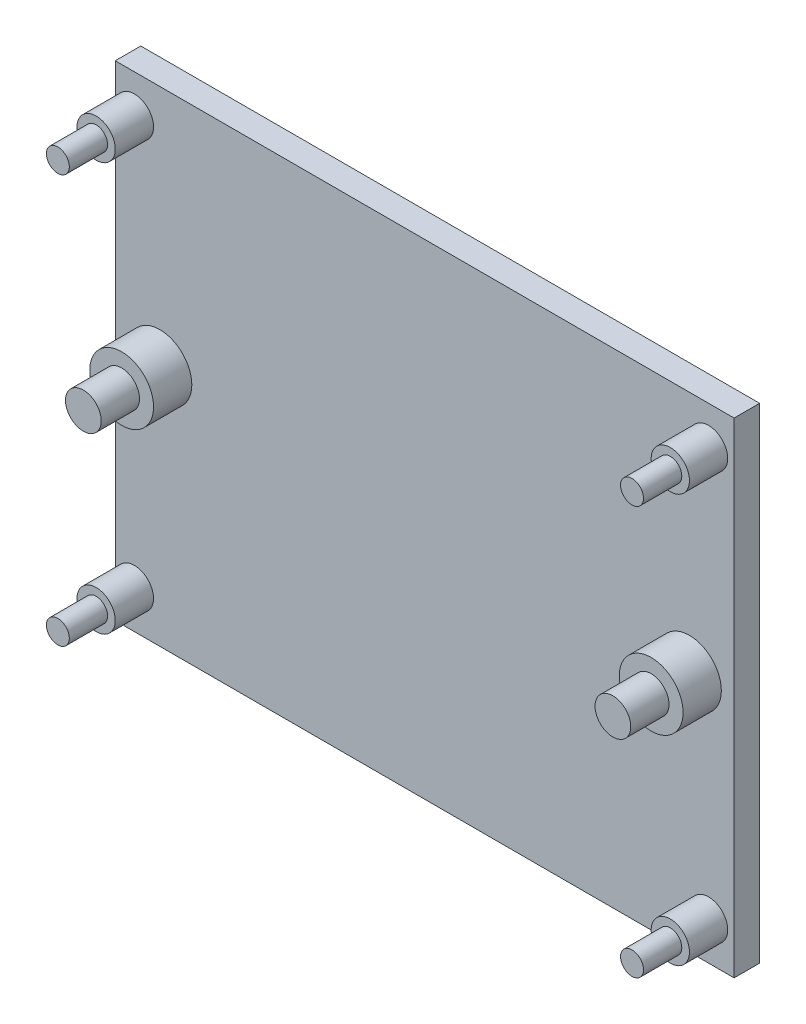
ISO-10303-21;
HEADER;
FILE_DESCRIPTION(('STEP AP214'),'2;1');
FILE_NAME('part.step','',(''),(''),'','','');
FILE_SCHEMA(('AUTOMOTIVE_DESIGN { 1 0 10303 214 1 1 1 1 }'));
ENDSEC;
DATA;
#1=APPLICATION_CONTEXT('core data for automotive mechanical design processes');
#2=APPLICATION_PROTOCOL_DEFINITION('international standard','automotive_design',2000,#1);
#3=PRODUCT_CONTEXT('',#1,'mechanical');
#4=PRODUCT('Part','Part','',(#3));
#5=PRODUCT_RELATED_PRODUCT_CATEGORY('part','',(#4));
#6=PRODUCT_DEFINITION_FORMATION('','',#4);
#7=PRODUCT_DEFINITION_CONTEXT('part definition',#1,'design');
#8=PRODUCT_DEFINITION('design','',#6,#7);
#9=PRODUCT_DEFINITION_SHAPE('','',#8);
#10=(LENGTH_UNIT() NAMED_UNIT(*) SI_UNIT(.MILLI.,.METRE.));
#11=(NAMED_UNIT(*) PLANE_ANGLE_UNIT() SI_UNIT($,.RADIAN.));
#12=(NAMED_UNIT(*) SI_UNIT($,.STERADIAN.) SOLID_ANGLE_UNIT());
#13=UNCERTAINTY_MEASURE_WITH_UNIT(LENGTH_MEASURE(1.E-05),#10,'distance_accuracy_value','');
#14=(GEOMETRIC_REPRESENTATION_CONTEXT(3) GLOBAL_UNCERTAINTY_ASSIGNED_CONTEXT((#13)) GLOBAL_UNIT_ASSIGNED_CONTEXT((#10,
#11,#12)) REPRESENTATION_CONTEXT('',''));
#15=CARTESIAN_POINT('',(0.,0.,0.));
#16=DIRECTION('',(0.,0.,1.));
#17=DIRECTION('',(1.,0.,0.));
#18=AXIS2_PLACEMENT_3D('',#15,#16,#17);
#19=CARTESIAN_POINT('',(0.,0.,0.));
#20=DIRECTION('',(0.,0.,1.));
#21=DIRECTION('',(1.,0.,0.));
#22=AXIS2_PLACEMENT_3D('',#19,#20,#21);
#23=PLANE('',#22);
#24=DIRECTION('',(0.,-1.,0.));
#25=VECTOR('',#24,1.);
#26=CARTESIAN_POINT('',(-8.40044641670906,4.85,0.));
#27=LINE('',#26,#25);
#28=CARTESIAN_POINT('',(-8.40044641670906,4.85,0.));
#29=VERTEX_POINT('',#28);
#30=CARTESIAN_POINT('',(-8.40044641670906,-4.85,0.));
#31=VERTEX_POINT('',#30);
#32=EDGE_CURVE('E317',#29,#31,#27,.T.);
#33=ORIENTED_EDGE('',*,*,#32,.F.);
#34=DIRECTION('',(-0.866025403784439,-0.5,0.));
#35=VECTOR('',#34,1.);
#36=CARTESIAN_POINT('',(0.,9.7,0.));
#37=LINE('',#36,#35);
#38=CARTESIAN_POINT('',(0.,9.7,0.));
#39=VERTEX_POINT('',#38);
#40=EDGE_CURVE('E329',#39,#29,#37,.T.);
#41=ORIENTED_EDGE('',*,*,#40,.F.);
#42=DIRECTION('',(-0.866025403784439,0.5,0.));
#43=VECTOR('',#42,1.);
#44=CARTESIAN_POINT('',(8.40044641670906,4.85,0.));
#45=LINE('',#44,#43);
#46=CARTESIAN_POINT('',(8.40044641670906,4.85,0.));
#47=VERTEX_POINT('',#46);
#48=EDGE_CURVE('E326',#47,#39,#45,.T.);
#49=ORIENTED_EDGE('',*,*,#48,.F.);
#50=DIRECTION('',(0.,1.,0.));
#51=VECTOR('',#50,1.);
#52=CARTESIAN_POINT('',(8.40044641670906,-4.85,0.));
#53=LINE('',#52,#51);
#54=CARTESIAN_POINT('',(8.40044641670906,-4.85,0.));
#55=VERTEX_POINT('',#54);
#56=EDGE_CURVE('E325',#55,#47,#53,.T.);
#57=ORIENTED_EDGE('',*,*,#56,.F.);
#58=DIRECTION('',(0.866025403784439,0.5,0.));
#59=VECTOR('',#58,1.);
#60=CARTESIAN_POINT('',(0.,-9.7,0.));
#61=LINE('',#60,#59);
#62=CARTESIAN_POINT('',(0.,-9.7,0.));
#63=VERTEX_POINT('',#62);
#64=EDGE_CURVE('E318',#63,#55,#61,.T.);
#65=ORIENTED_EDGE('',*,*,#64,.F.);
#66=DIRECTION('',(0.866025403784439,-0.5,0.));
#67=VECTOR('',#66,1.);
#68=CARTESIAN_POINT('',(-8.40044641670906,-4.85,0.));
#69=LINE('',#68,#67);
#70=EDGE_CURVE('E313',#31,#63,#69,.T.);
#71=ORIENTED_EDGE('',*,*,#70,.F.);
#72=EDGE_LOOP('',(#33,#41,#49,#57,#65,#71));
#73=FACE_BOUND('',#72,.T.);
#74=ADVANCED_FACE('F70',(#73),#23,.F.);
#75=CARTESIAN_POINT('',(-4.20022320835453,7.27500000000001,0.));
#76=DIRECTION('',(0.5,-0.866025403784439,0.));
#77=DIRECTION('',(0.866025403784439,0.5,0.));
#78=AXIS2_PLACEMENT_3D('',#75,#76,#77);
#79=PLANE('',#78);
#80=DIRECTION('',(0.,0.,1.));
#81=VECTOR('',#80,1.);
#82=CARTESIAN_POINT('',(-8.40044641670906,4.85,0.));
#83=LINE('',#82,#81);
#84=CARTESIAN_POINT('',(-8.40044641670906,4.85,2.5));
#85=VERTEX_POINT('',#84);
#86=EDGE_CURVE('E333',#29,#85,#83,.T.);
#87=ORIENTED_EDGE('',*,*,#86,.T.);
#88=DIRECTION('',(-0.866025403784439,-0.5,0.));
#89=VECTOR('',#88,1.);
#90=CARTESIAN_POINT('',(0.,9.7,2.5));
#91=LINE('',#90,#89);
#92=CARTESIAN_POINT('',(0.,9.7,2.5));
#93=VERTEX_POINT('',#92);
#94=EDGE_CURVE('E234',#93,#85,#91,.T.);
#95=ORIENTED_EDGE('',*,*,#94,.F.);
#96=DIRECTION('',(0.,0.,1.));
#97=VECTOR('',#96,1.);
#98=CARTESIAN_POINT('',(0.,9.7,0.));
#99=LINE('',#98,#97);
#100=EDGE_CURVE('E355',#39,#93,#99,.T.);
#101=ORIENTED_EDGE('',*,*,#100,.F.);
#102=ORIENTED_EDGE('',*,*,#40,.T.);
#103=EDGE_LOOP('',(#87,#95,#101,#102));
#104=FACE_BOUND('',#103,.T.);
#105=ADVANCED_FACE('F272',(#104),#79,.F.);
#106=CARTESIAN_POINT('',(4.20022320835453,7.275,0.));
#107=DIRECTION('',(-0.5,-0.866025403784439,0.));
#108=DIRECTION('',(0.866025403784439,-0.5,0.));
#109=AXIS2_PLACEMENT_3D('',#106,#107,#108);
#110=PLANE('',#109);
#111=ORIENTED_EDGE('',*,*,#100,.T.);
#112=DIRECTION('',(-0.866025403784439,0.5,0.));
#113=VECTOR('',#112,1.);
#114=CARTESIAN_POINT('',(8.40044641670906,4.85,2.5));
#115=LINE('',#114,#113);
#116=CARTESIAN_POINT('',(8.40044641670906,4.85,2.5));
#117=VERTEX_POINT('',#116);
#118=EDGE_CURVE('E252',#117,#93,#115,.T.);
#119=ORIENTED_EDGE('',*,*,#118,.F.);
#120=DIRECTION('',(0.,0.,1.));
#121=VECTOR('',#120,1.);
#122=CARTESIAN_POINT('',(8.40044641670906,4.85,0.));
#123=LINE('',#122,#121);
#124=EDGE_CURVE('E87',#47,#117,#123,.T.);
#125=ORIENTED_EDGE('',*,*,#124,.F.);
#126=ORIENTED_EDGE('',*,*,#48,.T.);
#127=EDGE_LOOP('',(#111,#119,#125,#126));
#128=FACE_BOUND('',#127,.T.);
#129=ADVANCED_FACE('F353',(#128),#110,.F.);
#130=CARTESIAN_POINT('',(-8.40044641670906,0.,0.));
#131=DIRECTION('',(1.,0.,0.));
#132=DIRECTION('',(0.,0.,-1.));
#133=AXIS2_PLACEMENT_3D('',#130,#131,#132);
#134=PLANE('',#133);
#135=DIRECTION('',(0.,0.,1.));
#136=VECTOR('',#135,1.);
#137=CARTESIAN_POINT('',(-8.40044641670906,-4.85,0.));
#138=LINE('',#137,#136);
#139=CARTESIAN_POINT('',(-8.40044641670906,-4.85,2.5));
#140=VERTEX_POINT('',#139);
#141=EDGE_CURVE('E357',#31,#140,#138,.T.);
#142=ORIENTED_EDGE('',*,*,#141,.T.);
#143=DIRECTION('',(0.,-1.,0.));
#144=VECTOR('',#143,1.);
#145=CARTESIAN_POINT('',(-8.40044641670906,4.85,2.5));
#146=LINE('',#145,#144);
#147=EDGE_CURVE('E233',#85,#140,#146,.T.);
#148=ORIENTED_EDGE('',*,*,#147,.F.);
#149=ORIENTED_EDGE('',*,*,#86,.F.);
#150=ORIENTED_EDGE('',*,*,#32,.T.);
#151=EDGE_LOOP('',(#142,#148,#149,#150));
#152=FACE_BOUND('',#151,.T.);
#153=ADVANCED_FACE('F380',(#152),#134,.F.);
#154=CARTESIAN_POINT('',(-4.20022320835453,-7.27500000000001,0.));
#155=DIRECTION('',(0.5,0.866025403784439,0.));
#156=DIRECTION('',(-0.866025403784439,0.5,0.));
#157=AXIS2_PLACEMENT_3D('',#154,#155,#156);
#158=PLANE('',#157);
#159=DIRECTION('',(0.,0.,1.));
#160=VECTOR('',#159,1.);
#161=CARTESIAN_POINT('',(0.,-9.7,0.));
#162=LINE('',#161,#160);
#163=CARTESIAN_POINT('',(0.,-9.69999999999999,2.5));
#164=VERTEX_POINT('',#163);
#165=EDGE_CURVE('E356',#63,#164,#162,.T.);
#166=ORIENTED_EDGE('',*,*,#165,.T.);
#167=DIRECTION('',(0.866025403784439,-0.5,0.));
#168=VECTOR('',#167,1.);
#169=CARTESIAN_POINT('',(-8.40044641670906,-4.85,2.5));
#170=LINE('',#169,#168);
#171=EDGE_CURVE('E239',#140,#164,#170,.T.);
#172=ORIENTED_EDGE('',*,*,#171,.F.);
#173=ORIENTED_EDGE('',*,*,#141,.F.);
#174=ORIENTED_EDGE('',*,*,#70,.T.);
#175=EDGE_LOOP('',(#166,#172,#173,#174));
#176=FACE_BOUND('',#175,.T.);
#177=ADVANCED_FACE('F387',(#176),#158,.F.);
#178=CARTESIAN_POINT('',(4.20022320835453,-7.275,0.));
#179=DIRECTION('',(-0.5,0.866025403784439,0.));
#180=DIRECTION('',(-0.866025403784439,-0.5,0.));
#181=AXIS2_PLACEMENT_3D('',#178,#179,#180);
#182=PLANE('',#181);
#183=DIRECTION('',(0.,0.,1.));
#184=VECTOR('',#183,1.);
#185=CARTESIAN_POINT('',(8.40044641670906,-4.85,0.));
#186=LINE('',#185,#184);
#187=CARTESIAN_POINT('',(8.40044641670906,-4.84999999999999,2.5));
#188=VERTEX_POINT('',#187);
#189=EDGE_CURVE('E403',#55,#188,#186,.T.);
#190=ORIENTED_EDGE('',*,*,#189,.T.);
#191=DIRECTION('',(0.866025403784439,0.5,0.));
#192=VECTOR('',#191,1.);
#193=CARTESIAN_POINT('',(0.,-9.69999999999999,2.5));
#194=LINE('',#193,#192);
#195=EDGE_CURVE('E242',#164,#188,#194,.T.);
#196=ORIENTED_EDGE('',*,*,#195,.F.);
#197=ORIENTED_EDGE('',*,*,#165,.F.);
#198=ORIENTED_EDGE('',*,*,#64,.T.);
#199=EDGE_LOOP('',(#190,#196,#197,#198));
#200=FACE_BOUND('',#199,.T.);
#201=ADVANCED_FACE('F388',(#200),#182,.F.);
#202=CARTESIAN_POINT('',(8.40044641670906,0.,0.));
#203=DIRECTION('',(-1.,0.,0.));
#204=DIRECTION('',(0.,0.,1.));
#205=AXIS2_PLACEMENT_3D('',#202,#203,#204);
#206=PLANE('',#205);
#207=ORIENTED_EDGE('',*,*,#124,.T.);
#208=DIRECTION('',(0.,1.,0.));
#209=VECTOR('',#208,1.);
#210=CARTESIAN_POINT('',(8.40044641670906,-4.85,2.5));
#211=LINE('',#210,#209);
#212=EDGE_CURVE('E95',#188,#117,#211,.T.);
#213=ORIENTED_EDGE('',*,*,#212,.F.);
#214=ORIENTED_EDGE('',*,*,#189,.F.);
#215=ORIENTED_EDGE('',*,*,#56,.T.);
#216=EDGE_LOOP('',(#207,#213,#214,#215));
#217=FACE_BOUND('',#216,.T.);
#218=ADVANCED_FACE('F67',(#217),#206,.F.);
#219=CARTESIAN_POINT('',(24.25,-19.,5.));
#220=CARTESIAN_POINT('',(8.40044641670906,-4.84999999999999,2.5));
#221=CARTESIAN_POINT('',(20.2083333333333,-19.,5.));
#222=CARTESIAN_POINT('',(7.00037201392421,-5.65833333333333,2.5));
#223=CARTESIAN_POINT('',(16.1666666666667,-19.,5.));
#224=CARTESIAN_POINT('',(5.60029761113937,-6.46666666666666,2.5));
#225=CARTESIAN_POINT('',(8.08333333333334,-19.,5.));
#226=CARTESIAN_POINT('',(2.80014880556969,-8.08333333333333,2.5));
#227=CARTESIAN_POINT('',(4.04166666666668,-19.,5.));
#228=CARTESIAN_POINT('',(1.40007440278484,-8.89166666666666,2.5));
#229=CARTESIAN_POINT('',(0.,-19.,5.));
#230=CARTESIAN_POINT('',(0.,-9.69999999999999,2.5));
#231=B_SPLINE_SURFACE_WITH_KNOTS('',3,1,((#219,#220),(#221,#222),(#223,#224),(#225,#226),(#227,
#228),(#229,#230)),.UNSPECIFIED.,.F.,.F.,.F.,(4,2,4),(2,2),(0.,0.5,1.),(0.,1.),.UNSPECIFIED.);
#232=DIRECTION('',(1.,0.,0.));
#233=VECTOR('',#232,1.);
#234=CARTESIAN_POINT('',(24.25,-19.,5.));
#235=LINE('',#234,#233);
#236=CARTESIAN_POINT('',(0.,-19.,5.));
#237=VERTEX_POINT('',#236);
#238=CARTESIAN_POINT('',(24.25,-19.,5.));
#239=VERTEX_POINT('',#238);
#240=EDGE_CURVE('E199',#237,#239,#235,.T.);
#241=DIRECTION('',(0.,0.965715946433319,-0.259601060869172));
#242=VECTOR('',#241,1.);
#243=CARTESIAN_POINT('',(0.,-14.35,3.75));
#244=LINE('',#243,#242);
#245=EDGE_CURVE('E437',#237,#164,#244,.T.);
#246=DIRECTION('',(0.740859176157228,-0.661416568456314,0.116858050964013));
#247=VECTOR('',#246,1.);
#248=CARTESIAN_POINT('',(16.3252232083545,-11.925,3.75));
#249=LINE('',#248,#247);
#250=EDGE_CURVE('E211',#188,#239,#249,.T.);
#251=ORIENTED_EDGE('',*,*,#240,.F.);
#252=ORIENTED_EDGE('',*,*,#245,.T.);
#253=ORIENTED_EDGE('',*,*,#195,.T.);
#254=ORIENTED_EDGE('',*,*,#250,.T.);
#255=EDGE_LOOP('',(#251,#252,#253,#254));
#256=FACE_BOUND('',#255,.T.);
#257=ADVANCED_FACE('F434',(#256),#231,.T.);
#258=CARTESIAN_POINT('',(0.,-19.,5.));
#259=CARTESIAN_POINT('',(0.,-9.69999999999999,2.5));
#260=CARTESIAN_POINT('',(-4.04166666666665,-19.,5.));
#261=CARTESIAN_POINT('',(-1.40007440278484,-8.89166666666666,2.5));
#262=CARTESIAN_POINT('',(-8.08333333333332,-19.,5.));
#263=CARTESIAN_POINT('',(-2.80014880556968,-8.08333333333333,2.5));
#264=CARTESIAN_POINT('',(-16.1666666666667,-19.,5.));
#265=CARTESIAN_POINT('',(-5.60029761113937,-6.46666666666666,2.5));
#266=CARTESIAN_POINT('',(-20.2083333333333,-19.,5.));
#267=CARTESIAN_POINT('',(-7.00037201392421,-5.65833333333333,2.5));
#268=CARTESIAN_POINT('',(-24.25,-19.,5.));
#269=CARTESIAN_POINT('',(-8.40044641670906,-4.85,2.5));
#270=B_SPLINE_SURFACE_WITH_KNOTS('',3,1,((#258,#259),(#260,#261),(#262,#263),(#264,#265),(#266,
#267),(#268,#269)),.UNSPECIFIED.,.F.,.F.,.F.,(4,2,4),(2,2),(0.,0.5,1.),(0.,1.),.UNSPECIFIED.);
#271=CARTESIAN_POINT('',(-24.25,-19.,5.));
#272=VERTEX_POINT('',#271);
#273=EDGE_CURVE('E203',#272,#237,#235,.T.);
#274=DIRECTION('',(0.740859176157228,0.661416568456314,-0.116858050964013));
#275=VECTOR('',#274,1.);
#276=CARTESIAN_POINT('',(-16.3252232083545,-11.925,3.75));
#277=LINE('',#276,#275);
#278=EDGE_CURVE('E445',#272,#140,#277,.T.);
#279=ORIENTED_EDGE('',*,*,#273,.F.);
#280=ORIENTED_EDGE('',*,*,#278,.T.);
#281=ORIENTED_EDGE('',*,*,#171,.T.);
#282=ORIENTED_EDGE('',*,*,#245,.F.);
#283=EDGE_LOOP('',(#279,#280,#281,#282));
#284=FACE_BOUND('',#283,.T.);
#285=ADVANCED_FACE('F568',(#284),#270,.T.);
#286=CARTESIAN_POINT('',(-0.180832822124491,0.,1.14644780155193));
#287=DIRECTION('',(-0.155806839777312,0.,0.987787542277491));
#288=DIRECTION('',(0.987787542277492,0.,0.155806839777312));
#289=AXIS2_PLACEMENT_3D('',#286,#287,#288);
#290=PLANE('',#289);
#291=ORIENTED_EDGE('',*,*,#250,.F.);
#292=ORIENTED_EDGE('',*,*,#212,.T.);
#293=DIRECTION('',(-0.740859176157228,-0.661416568456314,-0.116858050964013));
#294=VECTOR('',#293,1.);
#295=CARTESIAN_POINT('',(16.3252232083545,11.925,3.75));
#296=LINE('',#295,#294);
#297=CARTESIAN_POINT('',(24.25,19.,5.));
#298=VERTEX_POINT('',#297);
#299=EDGE_CURVE('E343',#298,#117,#296,.T.);
#300=ORIENTED_EDGE('',*,*,#299,.F.);
#301=DIRECTION('',(0.,1.,0.));
#302=VECTOR('',#301,1.);
#303=CARTESIAN_POINT('',(24.25,-19.,5.));
#304=LINE('',#303,#302);
#305=EDGE_CURVE('E204',#239,#298,#304,.T.);
#306=ORIENTED_EDGE('',*,*,#305,.F.);
#307=EDGE_LOOP('',(#291,#292,#300,#306));
#308=FACE_BOUND('',#307,.T.);
#309=ADVANCED_FACE('F439',(#308),#290,.F.);
#310=CARTESIAN_POINT('',(0.180832822124491,0.,1.14644780155194));
#311=DIRECTION('',(0.155806839777312,0.,0.987787542277492));
#312=DIRECTION('',(0.987787542277492,0.,-0.155806839777312));
#313=AXIS2_PLACEMENT_3D('',#310,#311,#312);
#314=PLANE('',#313);
#315=DIRECTION('',(0.740859176157228,-0.661416568456314,-0.116858050964013));
#316=VECTOR('',#315,1.);
#317=CARTESIAN_POINT('',(-24.25,19.,5.));
#318=LINE('',#317,#316);
#319=CARTESIAN_POINT('',(-24.25,19.,5.));
#320=VERTEX_POINT('',#319);
#321=EDGE_CURVE('E455',#320,#85,#318,.T.);
#322=ORIENTED_EDGE('',*,*,#321,.T.);
#323=ORIENTED_EDGE('',*,*,#147,.T.);
#324=ORIENTED_EDGE('',*,*,#278,.F.);
#325=DIRECTION('',(0.,-1.,0.));
#326=VECTOR('',#325,1.);
#327=CARTESIAN_POINT('',(-24.25,-19.,5.));
#328=LINE('',#327,#326);
#329=EDGE_CURVE('E196',#320,#272,#328,.T.);
#330=ORIENTED_EDGE('',*,*,#329,.F.);
#331=EDGE_LOOP('',(#322,#323,#324,#330));
#332=FACE_BOUND('',#331,.T.);
#333=ADVANCED_FACE('F586',(#332),#314,.F.);
#334=CARTESIAN_POINT('',(-24.25,19.,5.));
#335=CARTESIAN_POINT('',(-8.40044641670906,4.85,2.5));
#336=CARTESIAN_POINT('',(-20.2083333333332,19.,5.));
#337=CARTESIAN_POINT('',(-7.00037201392421,5.65833333333333,2.5));
#338=CARTESIAN_POINT('',(-16.1666666666665,19.,5.));
#339=CARTESIAN_POINT('',(-5.60029761113936,6.46666666666667,2.5));
#340=CARTESIAN_POINT('',(-8.08333333333315,19.,5.));
#341=CARTESIAN_POINT('',(-2.80014880556968,8.08333333333334,2.5));
#342=CARTESIAN_POINT('',(-4.04166666666655,19.,5.));
#343=CARTESIAN_POINT('',(-1.40007440278484,8.89166666666667,2.5));
#344=CARTESIAN_POINT('',(0.,19.,5.));
#345=CARTESIAN_POINT('',(0.,9.7,2.5));
#346=B_SPLINE_SURFACE_WITH_KNOTS('',3,1,((#334,#335),(#336,#337),(#338,#339),(#340,#341),(#342,
#343),(#344,#345)),.UNSPECIFIED.,.F.,.F.,.F.,(4,2,4),(2,2),(0.,0.5,1.),(0.,1.),.UNSPECIFIED.);
#347=DIRECTION('',(-1.,0.,0.));
#348=VECTOR('',#347,1.);
#349=CARTESIAN_POINT('',(24.25,19.,5.));
#350=LINE('',#349,#348);
#351=CARTESIAN_POINT('',(0.,19.,5.));
#352=VERTEX_POINT('',#351);
#353=EDGE_CURVE('E195',#352,#320,#350,.T.);
#354=DIRECTION('',(0.,-0.965715946433319,-0.259601060869172));
#355=VECTOR('',#354,1.);
#356=CARTESIAN_POINT('',(0.,14.35,3.75));
#357=LINE('',#356,#355);
#358=EDGE_CURVE('E446',#352,#93,#357,.T.);
#359=ORIENTED_EDGE('',*,*,#353,.F.);
#360=ORIENTED_EDGE('',*,*,#358,.T.);
#361=ORIENTED_EDGE('',*,*,#94,.T.);
#362=ORIENTED_EDGE('',*,*,#321,.F.);
#363=EDGE_LOOP('',(#359,#360,#361,#362));
#364=FACE_BOUND('',#363,.T.);
#365=ADVANCED_FACE('F467',(#364),#346,.T.);
#366=CARTESIAN_POINT('',(0.,19.,5.));
#367=CARTESIAN_POINT('',(0.,9.7,2.5));
#368=CARTESIAN_POINT('',(4.04166666666667,19.,5.));
#369=CARTESIAN_POINT('',(1.40007440278484,8.89166666666667,2.5));
#370=CARTESIAN_POINT('',(8.08333333333334,19.,5.));
#371=CARTESIAN_POINT('',(2.80014880556968,8.08333333333333,2.5));
#372=CARTESIAN_POINT('',(16.1666666666667,19.,5.));
#373=CARTESIAN_POINT('',(5.60029761113937,6.46666666666667,2.5));
#374=CARTESIAN_POINT('',(20.2083333333333,19.,5.));
#375=CARTESIAN_POINT('',(7.00037201392421,5.65833333333333,2.5));
#376=CARTESIAN_POINT('',(24.25,19.,5.));
#377=CARTESIAN_POINT('',(8.40044641670906,4.85,2.5));
#378=B_SPLINE_SURFACE_WITH_KNOTS('',3,1,((#366,#367),(#368,#369),(#370,#371),(#372,#373),(#374,
#375),(#376,#377)),.UNSPECIFIED.,.F.,.F.,.F.,(4,2,4),(2,2),(0.,0.5,1.),(0.,1.),.UNSPECIFIED.);
#379=EDGE_CURVE('E71',#298,#352,#350,.T.);
#380=ORIENTED_EDGE('',*,*,#379,.F.);
#381=ORIENTED_EDGE('',*,*,#299,.T.);
#382=ORIENTED_EDGE('',*,*,#118,.T.);
#383=ORIENTED_EDGE('',*,*,#358,.F.);
#384=EDGE_LOOP('',(#380,#381,#382,#383));
#385=FACE_BOUND('',#384,.T.);
#386=ADVANCED_FACE('F274',(#385),#378,.T.);
#387=CARTESIAN_POINT('',(24.25,19.,7.));
#388=DIRECTION('',(0.,-1.,0.));
#389=DIRECTION('',(0.,0.,-1.));
#390=AXIS2_PLACEMENT_3D('',#387,#388,#389);
#391=PLANE('',#390);
#392=ORIENTED_EDGE('',*,*,#379,.T.);
#393=ORIENTED_EDGE('',*,*,#353,.T.);
#394=DIRECTION('',(0.,0.,-1.));
#395=VECTOR('',#394,1.);
#396=CARTESIAN_POINT('',(-24.25,19.,7.));
#397=LINE('',#396,#395);
#398=CARTESIAN_POINT('',(-24.25,19.,7.));
#399=VERTEX_POINT('',#398);
#400=EDGE_CURVE('E193',#399,#320,#397,.T.);
#401=ORIENTED_EDGE('',*,*,#400,.F.);
#402=DIRECTION('',(-1.,0.,0.));
#403=VECTOR('',#402,1.);
#404=CARTESIAN_POINT('',(24.25,19.,7.));
#405=LINE('',#404,#403);
#406=CARTESIAN_POINT('',(24.25,19.,7.));
#407=VERTEX_POINT('',#406);
#408=EDGE_CURVE('E169',#407,#399,#405,.T.);
#409=ORIENTED_EDGE('',*,*,#408,.F.);
#410=DIRECTION('',(0.,0.,-1.));
#411=VECTOR('',#410,1.);
#412=CARTESIAN_POINT('',(24.25,19.,7.));
#413=LINE('',#412,#411);
#414=EDGE_CURVE('E188',#407,#298,#413,.T.);
#415=ORIENTED_EDGE('',*,*,#414,.T.);
#416=EDGE_LOOP('',(#392,#393,#401,#409,#415));
#417=FACE_BOUND('',#416,.T.);
#418=ADVANCED_FACE('F480',(#417),#391,.F.);
#419=CARTESIAN_POINT('',(-24.25,-19.,7.));
#420=DIRECTION('',(1.,0.,0.));
#421=DIRECTION('',(0.,0.,-1.));
#422=AXIS2_PLACEMENT_3D('',#419,#420,#421);
#423=PLANE('',#422);
#424=ORIENTED_EDGE('',*,*,#329,.T.);
#425=DIRECTION('',(0.,0.,-1.));
#426=VECTOR('',#425,1.);
#427=CARTESIAN_POINT('',(-24.25,-19.,7.));
#428=LINE('',#427,#426);
#429=CARTESIAN_POINT('',(-24.25,-19.,7.));
#430=VERTEX_POINT('',#429);
#431=EDGE_CURVE('E214',#430,#272,#428,.T.);
#432=ORIENTED_EDGE('',*,*,#431,.F.);
#433=DIRECTION('',(0.,-1.,0.));
#434=VECTOR('',#433,1.);
#435=CARTESIAN_POINT('',(-24.25,-19.,7.));
#436=LINE('',#435,#434);
#437=CARTESIAN_POINT('',(-24.25,-16.,7.));
#438=VERTEX_POINT('',#437);
#439=EDGE_CURVE('E174',#438,#430,#436,.T.);
#440=ORIENTED_EDGE('',*,*,#439,.F.);
#441=CARTESIAN_POINT('',(-24.25,16.,7.));
#442=VERTEX_POINT('',#441);
#443=EDGE_CURVE('E171',#442,#438,#436,.T.);
#444=ORIENTED_EDGE('',*,*,#443,.F.);
#445=EDGE_CURVE('E165',#399,#442,#436,.T.);
#446=ORIENTED_EDGE('',*,*,#445,.F.);
#447=ORIENTED_EDGE('',*,*,#400,.T.);
#448=EDGE_LOOP('',(#424,#432,#440,#444,#446,#447));
#449=FACE_BOUND('',#448,.T.);
#450=ADVANCED_FACE('F180',(#449),#423,.F.);
#451=CARTESIAN_POINT('',(24.25,-19.,7.));
#452=DIRECTION('',(0.,1.,0.));
#453=DIRECTION('',(0.,0.,1.));
#454=AXIS2_PLACEMENT_3D('',#451,#452,#453);
#455=PLANE('',#454);
#456=ORIENTED_EDGE('',*,*,#273,.T.);
#457=ORIENTED_EDGE('',*,*,#240,.T.);
#458=DIRECTION('',(0.,0.,-1.));
#459=VECTOR('',#458,1.);
#460=CARTESIAN_POINT('',(24.25,-19.,7.));
#461=LINE('',#460,#459);
#462=CARTESIAN_POINT('',(24.25,-19.,7.));
#463=VERTEX_POINT('',#462);
#464=EDGE_CURVE('E219',#463,#239,#461,.T.);
#465=ORIENTED_EDGE('',*,*,#464,.F.);
#466=DIRECTION('',(1.,0.,0.));
#467=VECTOR('',#466,1.);
#468=CARTESIAN_POINT('',(24.25,-19.,7.));
#469=LINE('',#468,#467);
#470=EDGE_CURVE('E175',#430,#463,#469,.T.);
#471=ORIENTED_EDGE('',*,*,#470,.F.);
#472=ORIENTED_EDGE('',*,*,#431,.T.);
#473=EDGE_LOOP('',(#456,#457,#465,#471,#472));
#474=FACE_BOUND('',#473,.T.);
#475=ADVANCED_FACE('F556',(#474),#455,.F.);
#476=CARTESIAN_POINT('',(24.25,-19.,7.));
#477=DIRECTION('',(-1.,0.,0.));
#478=DIRECTION('',(0.,0.,1.));
#479=AXIS2_PLACEMENT_3D('',#476,#477,#478);
#480=PLANE('',#479);
#481=ORIENTED_EDGE('',*,*,#305,.T.);
#482=ORIENTED_EDGE('',*,*,#414,.F.);
#483=DIRECTION('',(0.,1.,0.));
#484=VECTOR('',#483,1.);
#485=CARTESIAN_POINT('',(24.25,-19.,7.));
#486=LINE('',#485,#484);
#487=EDGE_CURVE('E183',#463,#407,#486,.T.);
#488=ORIENTED_EDGE('',*,*,#487,.F.);
#489=ORIENTED_EDGE('',*,*,#464,.T.);
#490=EDGE_LOOP('',(#481,#482,#488,#489));
#491=FACE_BOUND('',#490,.T.);
#492=ADVANCED_FACE('F475',(#491),#480,.F.);
#493=CARTESIAN_POINT('',(0.,0.,7.));
#494=DIRECTION('',(0.,0.,-1.));
#495=DIRECTION('',(-1.,0.,0.));
#496=AXIS2_PLACEMENT_3D('',#493,#494,#495);
#497=PLANE('',#496);
#498=CARTESIAN_POINT('',(22.25,16.,7.));
#499=DIRECTION('',(0.,0.,1.));
#500=DIRECTION('',(1.,0.,0.));
#501=AXIS2_PLACEMENT_3D('',#498,#499,#500);
#502=CIRCLE('',#501,1.5);
#503=CARTESIAN_POINT('',(23.75,16.,7.));
#504=VERTEX_POINT('',#503);
#505=EDGE_CURVE('E496',#504,#504,#502,.T.);
#506=ORIENTED_EDGE('',*,*,#505,.F.);
#507=EDGE_LOOP('',(#506));
#508=FACE_BOUND('',#507,.T.);
#509=CARTESIAN_POINT('',(20.75,0.,7.));
#510=DIRECTION('',(0.,0.,1.));
#511=DIRECTION('',(1.,0.,0.));
#512=AXIS2_PLACEMENT_3D('',#509,#510,#511);
#513=CIRCLE('',#512,2.5);
#514=CARTESIAN_POINT('',(23.25,0.,7.));
#515=VERTEX_POINT('',#514);
#516=EDGE_CURVE('E493',#515,#515,#513,.T.);
#517=ORIENTED_EDGE('',*,*,#516,.F.);
#518=EDGE_LOOP('',(#517));
#519=FACE_BOUND('',#518,.T.);
#520=CARTESIAN_POINT('',(22.25,-16.,7.));
#521=DIRECTION('',(0.,0.,1.));
#522=DIRECTION('',(1.,0.,0.));
#523=AXIS2_PLACEMENT_3D('',#520,#521,#522);
#524=CIRCLE('',#523,1.5);
#525=CARTESIAN_POINT('',(23.75,-16.,7.));
#526=VERTEX_POINT('',#525);
#527=EDGE_CURVE('E489',#526,#526,#524,.T.);
#528=ORIENTED_EDGE('',*,*,#527,.F.);
#529=EDGE_LOOP('',(#528));
#530=FACE_BOUND('',#529,.T.);
#531=CARTESIAN_POINT('',(-20.75,0.,7.));
#532=DIRECTION('',(0.,0.,1.));
#533=DIRECTION('',(1.,0.,0.));
#534=AXIS2_PLACEMENT_3D('',#531,#532,#533);
#535=CIRCLE('',#534,2.5);
#536=CARTESIAN_POINT('',(-18.25,0.,7.));
#537=VERTEX_POINT('',#536);
#538=EDGE_CURVE('E260',#537,#537,#535,.T.);
#539=ORIENTED_EDGE('',*,*,#538,.F.);
#540=EDGE_LOOP('',(#539));
#541=FACE_BOUND('',#540,.T.);
#542=ORIENTED_EDGE('',*,*,#443,.T.);
#543=CARTESIAN_POINT('',(-22.75,-16.,7.));
#544=DIRECTION('',(0.,0.,1.));
#545=DIRECTION('',(1.,0.,0.));
#546=AXIS2_PLACEMENT_3D('',#543,#544,#545);
#547=CIRCLE('',#546,1.5);
#548=EDGE_CURVE('E507',#438,#438,#547,.T.);
#549=ORIENTED_EDGE('',*,*,#548,.F.);
#550=ORIENTED_EDGE('',*,*,#439,.T.);
#551=ORIENTED_EDGE('',*,*,#470,.T.);
#552=ORIENTED_EDGE('',*,*,#487,.T.);
#553=ORIENTED_EDGE('',*,*,#408,.T.);
#554=ORIENTED_EDGE('',*,*,#445,.T.);
#555=CARTESIAN_POINT('',(-22.75,16.,7.));
#556=DIRECTION('',(0.,0.,1.));
#557=DIRECTION('',(1.,0.,0.));
#558=AXIS2_PLACEMENT_3D('',#555,#556,#557);
#559=CIRCLE('',#558,1.5);
#560=EDGE_CURVE('E167',#442,#442,#559,.T.);
#561=ORIENTED_EDGE('',*,*,#560,.F.);
#562=EDGE_LOOP('',(#542,#549,#550,#551,#552,#553,#554,#561));
#563=FACE_BOUND('',#562,.T.);
#564=ADVANCED_FACE('F163',(#508,#519,#530,#541,#563),#497,.F.);
#565=CARTESIAN_POINT('',(-20.75,0.,10.));
#566=DIRECTION('',(0.,0.,-1.));
#567=DIRECTION('',(-1.,0.,0.));
#568=AXIS2_PLACEMENT_3D('',#565,#566,#567);
#569=CYLINDRICAL_SURFACE('',#568,2.5);
#570=CARTESIAN_POINT('',(-20.75,0.,10.));
#571=DIRECTION('',(0.,0.,1.));
#572=DIRECTION('',(1.,0.,0.));
#573=AXIS2_PLACEMENT_3D('',#570,#571,#572);
#574=CIRCLE('',#573,2.5);
#575=CARTESIAN_POINT('',(-18.25,0.,10.));
#576=VERTEX_POINT('',#575);
#577=EDGE_CURVE('E476',#576,#576,#574,.T.);
#578=ORIENTED_EDGE('',*,*,#577,.F.);
#579=EDGE_LOOP('',(#578));
#580=FACE_BOUND('',#579,.T.);
#581=ORIENTED_EDGE('',*,*,#538,.T.);
#582=EDGE_LOOP('',(#581));
#583=FACE_BOUND('',#582,.T.);
#584=ADVANCED_FACE('F547',(#580,#583),#569,.T.);
#585=CARTESIAN_POINT('',(-20.75,0.,10.));
#586=DIRECTION('',(0.,0.,1.));
#587=DIRECTION('',(1.,0.,0.));
#588=AXIS2_PLACEMENT_3D('',#585,#586,#587);
#589=PLANE('',#588);
#590=CARTESIAN_POINT('',(-20.75,0.,10.));
#591=DIRECTION('',(0.,0.,1.));
#592=DIRECTION('',(1.,0.,0.));
#593=AXIS2_PLACEMENT_3D('',#590,#591,#592);
#594=CIRCLE('',#593,1.4);
#595=CARTESIAN_POINT('',(-19.35,0.,10.));
#596=VERTEX_POINT('',#595);
#597=EDGE_CURVE('E12',#596,#596,#594,.T.);
#598=ORIENTED_EDGE('',*,*,#597,.F.);
#599=EDGE_LOOP('',(#598));
#600=FACE_BOUND('',#599,.T.);
#601=ORIENTED_EDGE('',*,*,#577,.T.);
#602=EDGE_LOOP('',(#601));
#603=FACE_BOUND('',#602,.T.);
#604=ADVANCED_FACE('F542',(#600,#603),#589,.T.);
#605=CARTESIAN_POINT('',(22.25,-16.,10.));
#606=DIRECTION('',(0.,0.,-1.));
#607=DIRECTION('',(-1.,0.,0.));
#608=AXIS2_PLACEMENT_3D('',#605,#606,#607);
#609=CYLINDRICAL_SURFACE('',#608,1.5);
#610=CARTESIAN_POINT('',(22.25,-16.,10.));
#611=DIRECTION('',(0.,0.,1.));
#612=DIRECTION('',(1.,0.,0.));
#613=AXIS2_PLACEMENT_3D('',#610,#611,#612);
#614=CIRCLE('',#613,1.5);
#615=CARTESIAN_POINT('',(23.75,-16.,10.));
#616=VERTEX_POINT('',#615);
#617=EDGE_CURVE('E504',#616,#616,#614,.T.);
#618=ORIENTED_EDGE('',*,*,#617,.F.);
#619=EDGE_LOOP('',(#618));
#620=FACE_BOUND('',#619,.T.);
#621=ORIENTED_EDGE('',*,*,#527,.T.);
#622=EDGE_LOOP('',(#621));
#623=FACE_BOUND('',#622,.T.);
#624=ADVANCED_FACE('F550',(#620,#623),#609,.T.);
#625=CARTESIAN_POINT('',(22.25,-16.,10.));
#626=DIRECTION('',(0.,0.,1.));
#627=DIRECTION('',(1.,0.,0.));
#628=AXIS2_PLACEMENT_3D('',#625,#626,#627);
#629=PLANE('',#628);
#630=CARTESIAN_POINT('',(22.25,-16.,10.));
#631=DIRECTION('',(0.,0.,1.));
#632=DIRECTION('',(1.,0.,0.));
#633=AXIS2_PLACEMENT_3D('',#630,#631,#632);
#634=CIRCLE('',#633,0.900000000000001);
#635=CARTESIAN_POINT('',(23.15,-16.,10.));
#636=VERTEX_POINT('',#635);
#637=EDGE_CURVE('E77',#636,#636,#634,.T.);
#638=ORIENTED_EDGE('',*,*,#637,.F.);
#639=EDGE_LOOP('',(#638));
#640=FACE_BOUND('',#639,.T.);
#641=ORIENTED_EDGE('',*,*,#617,.T.);
#642=EDGE_LOOP('',(#641));
#643=FACE_BOUND('',#642,.T.);
#644=ADVANCED_FACE('F645',(#640,#643),#629,.T.);
#645=CARTESIAN_POINT('',(20.75,0.,10.));
#646=DIRECTION('',(0.,0.,-1.));
#647=DIRECTION('',(-1.,0.,0.));
#648=AXIS2_PLACEMENT_3D('',#645,#646,#647);
#649=CYLINDRICAL_SURFACE('',#648,2.5);
#650=CARTESIAN_POINT('',(20.75,0.,10.));
#651=DIRECTION('',(0.,0.,1.));
#652=DIRECTION('',(1.,0.,0.));
#653=AXIS2_PLACEMENT_3D('',#650,#651,#652);
#654=CIRCLE('',#653,2.5);
#655=CARTESIAN_POINT('',(23.25,0.,10.));
#656=VERTEX_POINT('',#655);
#657=EDGE_CURVE('E477',#656,#656,#654,.T.);
#658=ORIENTED_EDGE('',*,*,#657,.F.);
#659=EDGE_LOOP('',(#658));
#660=FACE_BOUND('',#659,.T.);
#661=ORIENTED_EDGE('',*,*,#516,.T.);
#662=EDGE_LOOP('',(#661));
#663=FACE_BOUND('',#662,.T.);
#664=ADVANCED_FACE('F537',(#660,#663),#649,.T.);
#665=CARTESIAN_POINT('',(20.75,0.,10.));
#666=DIRECTION('',(0.,0.,1.));
#667=DIRECTION('',(1.,0.,0.));
#668=AXIS2_PLACEMENT_3D('',#665,#666,#667);
#669=PLANE('',#668);
#670=CARTESIAN_POINT('',(20.75,0.,10.));
#671=DIRECTION('',(0.,0.,1.));
#672=DIRECTION('',(1.,0.,0.));
#673=AXIS2_PLACEMENT_3D('',#670,#671,#672);
#674=CIRCLE('',#673,1.4);
#675=CARTESIAN_POINT('',(22.15,0.,10.));
#676=VERTEX_POINT('',#675);
#677=EDGE_CURVE('E841',#676,#676,#674,.T.);
#678=ORIENTED_EDGE('',*,*,#677,.F.);
#679=EDGE_LOOP('',(#678));
#680=FACE_BOUND('',#679,.T.);
#681=ORIENTED_EDGE('',*,*,#657,.T.);
#682=EDGE_LOOP('',(#681));
#683=FACE_BOUND('',#682,.T.);
#684=ADVANCED_FACE('F526',(#680,#683),#669,.T.);
#685=CARTESIAN_POINT('',(-22.75,16.,10.));
#686=DIRECTION('',(0.,0.,-1.));
#687=DIRECTION('',(-1.,0.,0.));
#688=AXIS2_PLACEMENT_3D('',#685,#686,#687);
#689=CYLINDRICAL_SURFACE('',#688,1.5);
#690=CARTESIAN_POINT('',(-22.75,16.,10.));
#691=DIRECTION('',(0.,0.,1.));
#692=DIRECTION('',(1.,0.,0.));
#693=AXIS2_PLACEMENT_3D('',#690,#691,#692);
#694=CIRCLE('',#693,1.5);
#695=CARTESIAN_POINT('',(-21.25,16.,10.));
#696=VERTEX_POINT('',#695);
#697=EDGE_CURVE('E490',#696,#696,#694,.T.);
#698=ORIENTED_EDGE('',*,*,#697,.F.);
#699=EDGE_LOOP('',(#698));
#700=FACE_BOUND('',#699,.T.);
#701=ORIENTED_EDGE('',*,*,#560,.T.);
#702=EDGE_LOOP('',(#701));
#703=FACE_BOUND('',#702,.T.);
#704=ADVANCED_FACE('F528',(#700,#703),#689,.T.);
#705=CARTESIAN_POINT('',(-22.75,16.,10.));
#706=DIRECTION('',(0.,0.,1.));
#707=DIRECTION('',(1.,0.,0.));
#708=AXIS2_PLACEMENT_3D('',#705,#706,#707);
#709=PLANE('',#708);
#710=CARTESIAN_POINT('',(-22.75,16.,10.));
#711=DIRECTION('',(0.,0.,1.));
#712=DIRECTION('',(1.,0.,0.));
#713=AXIS2_PLACEMENT_3D('',#710,#711,#712);
#714=CIRCLE('',#713,0.900000000000001);
#715=CARTESIAN_POINT('',(-21.85,16.,10.));
#716=VERTEX_POINT('',#715);
#717=EDGE_CURVE('E501',#716,#716,#714,.T.);
#718=ORIENTED_EDGE('',*,*,#717,.F.);
#719=EDGE_LOOP('',(#718));
#720=FACE_BOUND('',#719,.T.);
#721=ORIENTED_EDGE('',*,*,#697,.T.);
#722=EDGE_LOOP('',(#721));
#723=FACE_BOUND('',#722,.T.);
#724=ADVANCED_FACE('F521',(#720,#723),#709,.T.);
#725=CARTESIAN_POINT('',(-22.75,-16.,10.));
#726=DIRECTION('',(0.,0.,-1.));
#727=DIRECTION('',(-1.,0.,0.));
#728=AXIS2_PLACEMENT_3D('',#725,#726,#727);
#729=CYLINDRICAL_SURFACE('',#728,1.5);
#730=CARTESIAN_POINT('',(-22.75,-16.,10.));
#731=DIRECTION('',(0.,0.,1.));
#732=DIRECTION('',(1.,0.,0.));
#733=AXIS2_PLACEMENT_3D('',#730,#731,#732);
#734=CIRCLE('',#733,1.5);
#735=CARTESIAN_POINT('',(-21.25,-16.,10.));
#736=VERTEX_POINT('',#735);
#737=EDGE_CURVE('E511',#736,#736,#734,.T.);
#738=ORIENTED_EDGE('',*,*,#737,.F.);
#739=EDGE_LOOP('',(#738));
#740=FACE_BOUND('',#739,.T.);
#741=ORIENTED_EDGE('',*,*,#548,.T.);
#742=EDGE_LOOP('',(#741));
#743=FACE_BOUND('',#742,.T.);
#744=ADVANCED_FACE('F532',(#740,#743),#729,.T.);
#745=CARTESIAN_POINT('',(-22.75,-16.,10.));
#746=DIRECTION('',(0.,0.,1.));
#747=DIRECTION('',(1.,0.,0.));
#748=AXIS2_PLACEMENT_3D('',#745,#746,#747);
#749=PLANE('',#748);
#750=CARTESIAN_POINT('',(-22.75,-16.,10.));
#751=DIRECTION('',(0.,0.,1.));
#752=DIRECTION('',(1.,0.,0.));
#753=AXIS2_PLACEMENT_3D('',#750,#751,#752);
#754=CIRCLE('',#753,0.900000000000001);
#755=CARTESIAN_POINT('',(-21.85,-16.,10.));
#756=VERTEX_POINT('',#755);
#757=EDGE_CURVE('E855',#756,#756,#754,.T.);
#758=ORIENTED_EDGE('',*,*,#757,.F.);
#759=EDGE_LOOP('',(#758));
#760=FACE_BOUND('',#759,.T.);
#761=ORIENTED_EDGE('',*,*,#737,.T.);
#762=EDGE_LOOP('',(#761));
#763=FACE_BOUND('',#762,.T.);
#764=ADVANCED_FACE('F685',(#760,#763),#749,.T.);
#765=CARTESIAN_POINT('',(22.25,16.,10.));
#766=DIRECTION('',(0.,0.,-1.));
#767=DIRECTION('',(-1.,0.,0.));
#768=AXIS2_PLACEMENT_3D('',#765,#766,#767);
#769=CYLINDRICAL_SURFACE('',#768,1.5);
#770=CARTESIAN_POINT('',(22.25,16.,10.));
#771=DIRECTION('',(0.,0.,1.));
#772=DIRECTION('',(1.,0.,0.));
#773=AXIS2_PLACEMENT_3D('',#770,#771,#772);
#774=CIRCLE('',#773,1.5);
#775=CARTESIAN_POINT('',(23.75,16.,10.));
#776=VERTEX_POINT('',#775);
#777=EDGE_CURVE('E510',#776,#776,#774,.T.);
#778=ORIENTED_EDGE('',*,*,#777,.F.);
#779=EDGE_LOOP('',(#778));
#780=FACE_BOUND('',#779,.T.);
#781=ORIENTED_EDGE('',*,*,#505,.T.);
#782=EDGE_LOOP('',(#781));
#783=FACE_BOUND('',#782,.T.);
#784=ADVANCED_FACE('F692',(#780,#783),#769,.T.);
#785=CARTESIAN_POINT('',(22.25,16.,10.));
#786=DIRECTION('',(0.,0.,1.));
#787=DIRECTION('',(1.,0.,0.));
#788=AXIS2_PLACEMENT_3D('',#785,#786,#787);
#789=PLANE('',#788);
#790=CARTESIAN_POINT('',(22.25,16.,10.));
#791=DIRECTION('',(0.,0.,1.));
#792=DIRECTION('',(1.,0.,0.));
#793=AXIS2_PLACEMENT_3D('',#790,#791,#792);
#794=CIRCLE('',#793,0.900000000000001);
#795=CARTESIAN_POINT('',(23.15,16.,10.));
#796=VERTEX_POINT('',#795);
#797=EDGE_CURVE('E516',#796,#796,#794,.T.);
#798=ORIENTED_EDGE('',*,*,#797,.F.);
#799=EDGE_LOOP('',(#798));
#800=FACE_BOUND('',#799,.T.);
#801=ORIENTED_EDGE('',*,*,#777,.T.);
#802=EDGE_LOOP('',(#801));
#803=FACE_BOUND('',#802,.T.);
#804=ADVANCED_FACE('F705',(#800,#803),#789,.T.);
#805=CARTESIAN_POINT('',(22.25,16.,13.));
#806=DIRECTION('',(0.,0.,-1.));
#807=DIRECTION('',(-1.,0.,0.));
#808=AXIS2_PLACEMENT_3D('',#805,#806,#807);
#809=CYLINDRICAL_SURFACE('',#808,0.900000000000001);
#810=CARTESIAN_POINT('',(22.25,16.,13.));
#811=DIRECTION('',(0.,0.,1.));
#812=DIRECTION('',(1.,0.,0.));
#813=AXIS2_PLACEMENT_3D('',#810,#811,#812);
#814=CIRCLE('',#813,0.900000000000001);
#815=CARTESIAN_POINT('',(23.15,16.,13.));
#816=VERTEX_POINT('',#815);
#817=EDGE_CURVE('E852',#816,#816,#814,.T.);
#818=ORIENTED_EDGE('',*,*,#817,.F.);
#819=EDGE_LOOP('',(#818));
#820=FACE_BOUND('',#819,.T.);
#821=ORIENTED_EDGE('',*,*,#797,.T.);
#822=EDGE_LOOP('',(#821));
#823=FACE_BOUND('',#822,.T.);
#824=ADVANCED_FACE('F711',(#820,#823),#809,.T.);
#825=CARTESIAN_POINT('',(22.25,16.,13.));
#826=DIRECTION('',(0.,0.,1.));
#827=DIRECTION('',(1.,0.,0.));
#828=AXIS2_PLACEMENT_3D('',#825,#826,#827);
#829=PLANE('',#828);
#830=ORIENTED_EDGE('',*,*,#817,.T.);
#831=EDGE_LOOP('',(#830));
#832=FACE_BOUND('',#831,.T.);
#833=ADVANCED_FACE('F723',(#832),#829,.T.);
#834=CARTESIAN_POINT('',(-22.75,-16.,13.));
#835=DIRECTION('',(0.,0.,-1.));
#836=DIRECTION('',(-1.,0.,0.));
#837=AXIS2_PLACEMENT_3D('',#834,#835,#836);
#838=CYLINDRICAL_SURFACE('',#837,0.900000000000001);
#839=CARTESIAN_POINT('',(-22.75,-16.,13.));
#840=DIRECTION('',(0.,0.,1.));
#841=DIRECTION('',(1.,0.,0.));
#842=AXIS2_PLACEMENT_3D('',#839,#840,#841);
#843=CIRCLE('',#842,0.900000000000001);
#844=CARTESIAN_POINT('',(-21.85,-16.,13.));
#845=VERTEX_POINT('',#844);
#846=EDGE_CURVE('E853',#845,#845,#843,.T.);
#847=ORIENTED_EDGE('',*,*,#846,.F.);
#848=EDGE_LOOP('',(#847));
#849=FACE_BOUND('',#848,.T.);
#850=ORIENTED_EDGE('',*,*,#757,.T.);
#851=EDGE_LOOP('',(#850));
#852=FACE_BOUND('',#851,.T.);
#853=ADVANCED_FACE('F732',(#849,#852),#838,.T.);
#854=CARTESIAN_POINT('',(-22.75,-16.,13.));
#855=DIRECTION('',(0.,0.,1.));
#856=DIRECTION('',(1.,0.,0.));
#857=AXIS2_PLACEMENT_3D('',#854,#855,#856);
#858=PLANE('',#857);
#859=ORIENTED_EDGE('',*,*,#846,.T.);
#860=EDGE_LOOP('',(#859));
#861=FACE_BOUND('',#860,.T.);
#862=ADVANCED_FACE('F742',(#861),#858,.T.);
#863=CARTESIAN_POINT('',(-22.75,16.,13.));
#864=DIRECTION('',(0.,0.,-1.));
#865=DIRECTION('',(-1.,0.,0.));
#866=AXIS2_PLACEMENT_3D('',#863,#864,#865);
#867=CYLINDRICAL_SURFACE('',#866,0.900000000000001);
#868=CARTESIAN_POINT('',(-22.75,16.,13.));
#869=DIRECTION('',(0.,0.,1.));
#870=DIRECTION('',(1.,0.,0.));
#871=AXIS2_PLACEMENT_3D('',#868,#869,#870);
#872=CIRCLE('',#871,0.900000000000001);
#873=CARTESIAN_POINT('',(-21.85,16.,13.));
#874=VERTEX_POINT('',#873);
#875=EDGE_CURVE('E508',#874,#874,#872,.T.);
#876=ORIENTED_EDGE('',*,*,#875,.F.);
#877=EDGE_LOOP('',(#876));
#878=FACE_BOUND('',#877,.T.);
#879=ORIENTED_EDGE('',*,*,#717,.T.);
#880=EDGE_LOOP('',(#879));
#881=FACE_BOUND('',#880,.T.);
#882=ADVANCED_FACE('F753',(#878,#881),#867,.T.);
#883=CARTESIAN_POINT('',(-22.75,16.,13.));
#884=DIRECTION('',(0.,0.,1.));
#885=DIRECTION('',(1.,0.,0.));
#886=AXIS2_PLACEMENT_3D('',#883,#884,#885);
#887=PLANE('',#886);
#888=ORIENTED_EDGE('',*,*,#875,.T.);
#889=EDGE_LOOP('',(#888));
#890=FACE_BOUND('',#889,.T.);
#891=ADVANCED_FACE('F761',(#890),#887,.T.);
#892=CARTESIAN_POINT('',(20.75,0.,13.));
#893=DIRECTION('',(0.,0.,-1.));
#894=DIRECTION('',(-1.,0.,0.));
#895=AXIS2_PLACEMENT_3D('',#892,#893,#894);
#896=CYLINDRICAL_SURFACE('',#895,1.4);
#897=CARTESIAN_POINT('',(20.75,0.,13.));
#898=DIRECTION('',(0.,0.,1.));
#899=DIRECTION('',(1.,0.,0.));
#900=AXIS2_PLACEMENT_3D('',#897,#898,#899);
#901=CIRCLE('',#900,1.4);
#902=CARTESIAN_POINT('',(22.15,0.,13.));
#903=VERTEX_POINT('',#902);
#904=EDGE_CURVE('E860',#903,#903,#901,.T.);
#905=ORIENTED_EDGE('',*,*,#904,.F.);
#906=EDGE_LOOP('',(#905));
#907=FACE_BOUND('',#906,.T.);
#908=ORIENTED_EDGE('',*,*,#677,.T.);
#909=EDGE_LOOP('',(#908));
#910=FACE_BOUND('',#909,.T.);
#911=ADVANCED_FACE('F772',(#907,#910),#896,.T.);
#912=CARTESIAN_POINT('',(20.75,0.,13.));
#913=DIRECTION('',(0.,0.,1.));
#914=DIRECTION('',(1.,0.,0.));
#915=AXIS2_PLACEMENT_3D('',#912,#913,#914);
#916=PLANE('',#915);
#917=ORIENTED_EDGE('',*,*,#904,.T.);
#918=EDGE_LOOP('',(#917));
#919=FACE_BOUND('',#918,.T.);
#920=ADVANCED_FACE('F784',(#919),#916,.T.);
#921=CARTESIAN_POINT('',(22.25,-16.,13.));
#922=DIRECTION('',(0.,0.,-1.));
#923=DIRECTION('',(-1.,0.,0.));
#924=AXIS2_PLACEMENT_3D('',#921,#922,#923);
#925=CYLINDRICAL_SURFACE('',#924,0.900000000000001);
#926=CARTESIAN_POINT('',(22.25,-16.,13.));
#927=DIRECTION('',(0.,0.,1.));
#928=DIRECTION('',(1.,0.,0.));
#929=AXIS2_PLACEMENT_3D('',#926,#927,#928);
#930=CIRCLE('',#929,0.900000000000001);
#931=CARTESIAN_POINT('',(23.15,-16.,13.));
#932=VERTEX_POINT('',#931);
#933=EDGE_CURVE('E846',#932,#932,#930,.T.);
#934=ORIENTED_EDGE('',*,*,#933,.F.);
#935=EDGE_LOOP('',(#934));
#936=FACE_BOUND('',#935,.T.);
#937=ORIENTED_EDGE('',*,*,#637,.T.);
#938=EDGE_LOOP('',(#937));
#939=FACE_BOUND('',#938,.T.);
#940=ADVANCED_FACE('F793',(#936,#939),#925,.T.);
#941=CARTESIAN_POINT('',(22.25,-16.,13.));
#942=DIRECTION('',(0.,0.,1.));
#943=DIRECTION('',(1.,0.,0.));
#944=AXIS2_PLACEMENT_3D('',#941,#942,#943);
#945=PLANE('',#944);
#946=ORIENTED_EDGE('',*,*,#933,.T.);
#947=EDGE_LOOP('',(#946));
#948=FACE_BOUND('',#947,.T.);
#949=ADVANCED_FACE('F803',(#948),#945,.T.);
#950=CARTESIAN_POINT('',(-20.75,0.,13.));
#951=DIRECTION('',(0.,0.,-1.));
#952=DIRECTION('',(-1.,0.,0.));
#953=AXIS2_PLACEMENT_3D('',#950,#951,#952);
#954=CYLINDRICAL_SURFACE('',#953,1.4);
#955=CARTESIAN_POINT('',(-20.75,0.,13.));
#956=DIRECTION('',(0.,0.,1.));
#957=DIRECTION('',(1.,0.,0.));
#958=AXIS2_PLACEMENT_3D('',#955,#956,#957);
#959=CIRCLE('',#958,1.4);
#960=CARTESIAN_POINT('',(-19.35,0.,13.));
#961=VERTEX_POINT('',#960);
#962=EDGE_CURVE('E857',#961,#961,#959,.T.);
#963=ORIENTED_EDGE('',*,*,#962,.F.);
#964=EDGE_LOOP('',(#963));
#965=FACE_BOUND('',#964,.T.);
#966=ORIENTED_EDGE('',*,*,#597,.T.);
#967=EDGE_LOOP('',(#966));
#968=FACE_BOUND('',#967,.T.);
#969=ADVANCED_FACE('F811',(#965,#968),#954,.T.);
#970=CARTESIAN_POINT('',(-20.75,0.,13.));
#971=DIRECTION('',(0.,0.,1.));
#972=DIRECTION('',(1.,0.,0.));
#973=AXIS2_PLACEMENT_3D('',#970,#971,#972);
#974=PLANE('',#973);
#975=ORIENTED_EDGE('',*,*,#962,.T.);
#976=EDGE_LOOP('',(#975));
#977=FACE_BOUND('',#976,.T.);
#978=ADVANCED_FACE('F821',(#977),#974,.T.);
#979=CLOSED_SHELL('',(#74,#105,#129,#153,#177,#201,#218,#257,#285,#309,#333,#365,#386,#418,#450,
#475,#492,#564,#584,#604,#624,#644,#664,#684,#704,#724,#744,#764,#784,#804,#824,#833,#853,#862,
#882,#891,#911,#920,#940,#949,#969,#978));
#980=MANIFOLD_SOLID_BREP('B2',#979);
#981=ADVANCED_BREP_SHAPE_REPRESENTATION('',(#18,#980),#14);
#982=SHAPE_DEFINITION_REPRESENTATION(#9,#981);
ENDSEC;
END-ISO-10303-21;
